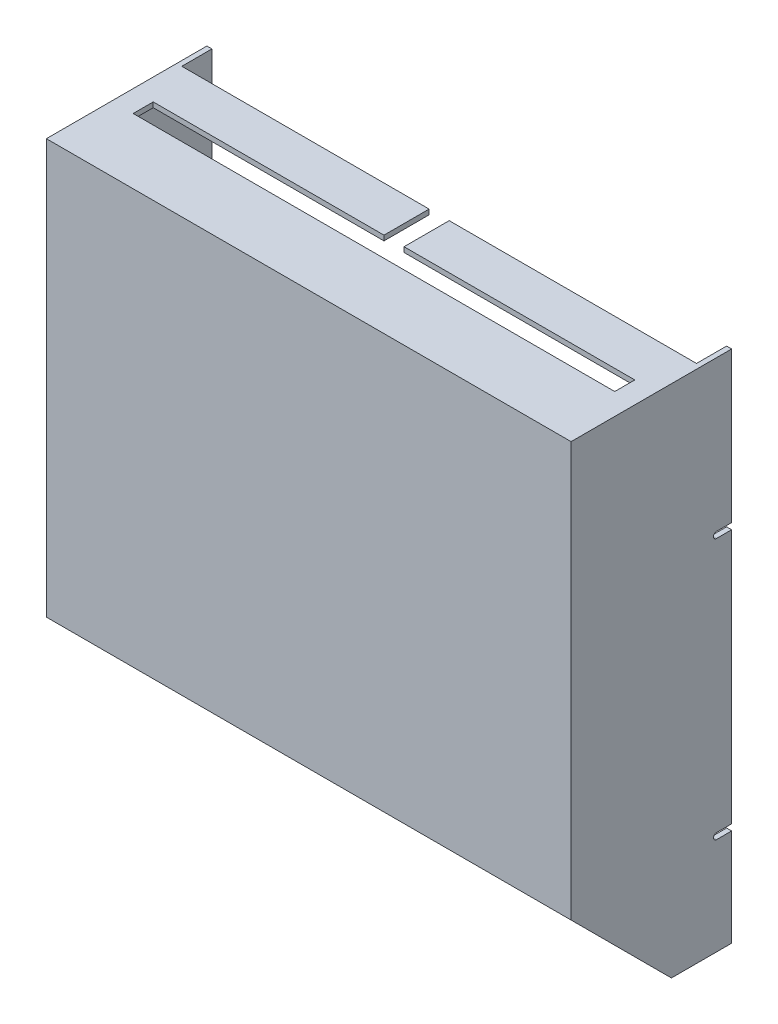
ISO-10303-21;
HEADER;
FILE_DESCRIPTION(('STEP AP214'),'2;1');
FILE_NAME('part.step','',(''),(''),'','','');
FILE_SCHEMA(('AUTOMOTIVE_DESIGN { 1 0 10303 214 1 1 1 1 }'));
ENDSEC;
DATA;
#1=APPLICATION_CONTEXT('core data for automotive mechanical design processes');
#2=APPLICATION_PROTOCOL_DEFINITION('international standard','automotive_design',2000,#1);
#3=PRODUCT_CONTEXT('',#1,'mechanical');
#4=PRODUCT('Part','Part','',(#3));
#5=PRODUCT_RELATED_PRODUCT_CATEGORY('part','',(#4));
#6=PRODUCT_DEFINITION_FORMATION('','',#4);
#7=PRODUCT_DEFINITION_CONTEXT('part definition',#1,'design');
#8=PRODUCT_DEFINITION('design','',#6,#7);
#9=PRODUCT_DEFINITION_SHAPE('','',#8);
#10=(LENGTH_UNIT() NAMED_UNIT(*) SI_UNIT(.MILLI.,.METRE.));
#11=(NAMED_UNIT(*) PLANE_ANGLE_UNIT() SI_UNIT($,.RADIAN.));
#12=(NAMED_UNIT(*) SI_UNIT($,.STERADIAN.) SOLID_ANGLE_UNIT());
#13=UNCERTAINTY_MEASURE_WITH_UNIT(LENGTH_MEASURE(1.E-05),#10,'distance_accuracy_value','');
#14=(GEOMETRIC_REPRESENTATION_CONTEXT(3) GLOBAL_UNCERTAINTY_ASSIGNED_CONTEXT((#13)) GLOBAL_UNIT_ASSIGNED_CONTEXT((#10,
#11,#12)) REPRESENTATION_CONTEXT('',''));
#15=CARTESIAN_POINT('',(0.,0.,0.));
#16=DIRECTION('',(0.,0.,1.));
#17=DIRECTION('',(1.,0.,0.));
#18=AXIS2_PLACEMENT_3D('',#15,#16,#17);
#19=CARTESIAN_POINT('',(0.,0.,-30.));
#20=DIRECTION('',(0.,0.,1.));
#21=DIRECTION('',(1.,0.,0.));
#22=AXIS2_PLACEMENT_3D('',#19,#20,#21);
#23=PLANE('',#22);
#24=DIRECTION('',(0.,-1.,0.));
#25=VECTOR('',#24,1.);
#26=CARTESIAN_POINT('',(283.,283.,-30.));
#27=LINE('',#26,#25);
#28=CARTESIAN_POINT('',(283.,-133.05,-30.));
#29=VERTEX_POINT('',#28);
#30=CARTESIAN_POINT('',(283.,-230.,-30.));
#31=VERTEX_POINT('',#30);
#32=EDGE_CURVE('E336',#29,#31,#27,.T.);
#33=ORIENTED_EDGE('',*,*,#32,.F.);
#34=DIRECTION('',(-1.,0.,0.));
#35=VECTOR('',#34,1.);
#36=CARTESIAN_POINT('',(307.052886920359,-133.05,-30.));
#37=LINE('',#36,#35);
#38=CARTESIAN_POINT('',(288.,-133.05,-30.));
#39=VERTEX_POINT('',#38);
#40=EDGE_CURVE('E535',#39,#29,#37,.T.);
#41=ORIENTED_EDGE('',*,*,#40,.F.);
#42=DIRECTION('',(0.,1.,0.));
#43=VECTOR('',#42,1.);
#44=CARTESIAN_POINT('',(288.,-230.,-30.));
#45=LINE('',#44,#43);
#46=CARTESIAN_POINT('',(288.,-230.,-30.));
#47=VERTEX_POINT('',#46);
#48=EDGE_CURVE('E340',#47,#39,#45,.T.);
#49=ORIENTED_EDGE('',*,*,#48,.F.);
#50=DIRECTION('',(1.,0.,0.));
#51=VECTOR('',#50,1.);
#52=CARTESIAN_POINT('',(283.,-230.,-30.));
#53=LINE('',#52,#51);
#54=EDGE_CURVE('E334',#31,#47,#53,.T.);
#55=ORIENTED_EDGE('',*,*,#54,.F.);
#56=EDGE_LOOP('',(#33,#41,#49,#55));
#57=FACE_BOUND('',#56,.T.);
#58=ADVANCED_FACE('F37',(#57),#23,.F.);
#59=CARTESIAN_POINT('',(0.,0.,-30.));
#60=DIRECTION('',(0.,0.,1.));
#61=DIRECTION('',(1.,0.,0.));
#62=AXIS2_PLACEMENT_3D('',#59,#60,#61);
#63=PLANE('',#62);
#64=DIRECTION('',(0.,-1.,0.));
#65=VECTOR('',#64,1.);
#66=CARTESIAN_POINT('',(-235.,283.,-30.));
#67=LINE('',#66,#65);
#68=CARTESIAN_POINT('',(-235.,-133.05,-30.));
#69=VERTEX_POINT('',#68);
#70=CARTESIAN_POINT('',(-235.,-230.,-30.));
#71=VERTEX_POINT('',#70);
#72=EDGE_CURVE('E306',#69,#71,#67,.T.);
#73=ORIENTED_EDGE('',*,*,#72,.F.);
#74=CARTESIAN_POINT('',(-230.,-133.05,-30.));
#75=VERTEX_POINT('',#74);
#76=EDGE_CURVE('E517',#75,#69,#37,.T.);
#77=ORIENTED_EDGE('',*,*,#76,.F.);
#78=DIRECTION('',(0.,1.,0.));
#79=VECTOR('',#78,1.);
#80=CARTESIAN_POINT('',(-230.,-230.,-30.));
#81=LINE('',#80,#79);
#82=CARTESIAN_POINT('',(-230.,-230.,-30.));
#83=VERTEX_POINT('',#82);
#84=EDGE_CURVE('E318',#83,#75,#81,.T.);
#85=ORIENTED_EDGE('',*,*,#84,.F.);
#86=DIRECTION('',(1.,0.,0.));
#87=VECTOR('',#86,1.);
#88=CARTESIAN_POINT('',(-235.,-230.,-30.));
#89=LINE('',#88,#87);
#90=EDGE_CURVE('E309',#71,#83,#89,.T.);
#91=ORIENTED_EDGE('',*,*,#90,.F.);
#92=EDGE_LOOP('',(#73,#77,#85,#91));
#93=FACE_BOUND('',#92,.T.);
#94=ADVANCED_FACE('F516',(#93),#63,.F.);
#95=CARTESIAN_POINT('',(288.,-126.95,-30.));
#96=VERTEX_POINT('',#95);
#97=CARTESIAN_POINT('',(288.,126.95,-30.));
#98=VERTEX_POINT('',#97);
#99=EDGE_CURVE('E344',#96,#98,#45,.T.);
#100=ORIENTED_EDGE('',*,*,#99,.F.);
#101=DIRECTION('',(-1.,0.,0.));
#102=VECTOR('',#101,1.);
#103=CARTESIAN_POINT('',(307.052886920359,-126.95,-30.));
#104=LINE('',#103,#102);
#105=CARTESIAN_POINT('',(283.,-126.95,-30.));
#106=VERTEX_POINT('',#105);
#107=EDGE_CURVE('E52',#96,#106,#104,.T.);
#108=ORIENTED_EDGE('',*,*,#107,.T.);
#109=CARTESIAN_POINT('',(283.,126.95,-30.));
#110=VERTEX_POINT('',#109);
#111=EDGE_CURVE('E335',#110,#106,#27,.T.);
#112=ORIENTED_EDGE('',*,*,#111,.F.);
#113=DIRECTION('',(-1.,0.,0.));
#114=VECTOR('',#113,1.);
#115=CARTESIAN_POINT('',(307.052886920359,126.95,-30.));
#116=LINE('',#115,#114);
#117=EDGE_CURVE('E569',#98,#110,#116,.T.);
#118=ORIENTED_EDGE('',*,*,#117,.F.);
#119=EDGE_LOOP('',(#100,#108,#112,#118));
#120=FACE_BOUND('',#119,.T.);
#121=ADVANCED_FACE('F689',(#120),#23,.F.);
#122=CARTESIAN_POINT('',(-230.,-126.95,-30.));
#123=VERTEX_POINT('',#122);
#124=CARTESIAN_POINT('',(-230.,126.95,-30.));
#125=VERTEX_POINT('',#124);
#126=EDGE_CURVE('E297',#123,#125,#81,.T.);
#127=ORIENTED_EDGE('',*,*,#126,.F.);
#128=CARTESIAN_POINT('',(-235.,-126.95,-30.));
#129=VERTEX_POINT('',#128);
#130=EDGE_CURVE('E285',#123,#129,#104,.T.);
#131=ORIENTED_EDGE('',*,*,#130,.T.);
#132=CARTESIAN_POINT('',(-235.,126.95,-30.));
#133=VERTEX_POINT('',#132);
#134=EDGE_CURVE('E296',#133,#129,#67,.T.);
#135=ORIENTED_EDGE('',*,*,#134,.F.);
#136=DIRECTION('',(1.,0.,0.));
#137=VECTOR('',#136,1.);
#138=CARTESIAN_POINT('',(0.,126.95,-30.));
#139=LINE('',#138,#137);
#140=EDGE_CURVE('E11',#133,#125,#139,.T.);
#141=ORIENTED_EDGE('',*,*,#140,.T.);
#142=EDGE_LOOP('',(#127,#131,#135,#141));
#143=FACE_BOUND('',#142,.T.);
#144=ADVANCED_FACE('F295',(#143),#63,.F.);
#145=CARTESIAN_POINT('',(0.,0.,0.));
#146=DIRECTION('',(0.,0.,-1.));
#147=DIRECTION('',(-1.,0.,0.));
#148=AXIS2_PLACEMENT_3D('',#145,#146,#147);
#149=PLANE('',#148);
#150=DIRECTION('',(0.,1.,0.));
#151=VECTOR('',#150,1.);
#152=CARTESIAN_POINT('',(-230.,-230.,0.));
#153=LINE('',#152,#151);
#154=CARTESIAN_POINT('',(-230.,278.,0.));
#155=VERTEX_POINT('',#154);
#156=CARTESIAN_POINT('',(-230.,283.,0.));
#157=VERTEX_POINT('',#156);
#158=EDGE_CURVE('E326',#155,#157,#153,.T.);
#159=ORIENTED_EDGE('',*,*,#158,.T.);
#160=DIRECTION('',(-1.,0.,0.));
#161=VECTOR('',#160,1.);
#162=CARTESIAN_POINT('',(288.,283.,0.));
#163=LINE('',#162,#161);
#164=CARTESIAN_POINT('',(16.4999999999999,283.,0.));
#165=VERTEX_POINT('',#164);
#166=EDGE_CURVE('E400',#165,#157,#163,.T.);
#167=ORIENTED_EDGE('',*,*,#166,.F.);
#168=DIRECTION('',(0.,1.,0.));
#169=VECTOR('',#168,1.);
#170=CARTESIAN_POINT('',(16.4999999999999,273.,0.));
#171=LINE('',#170,#169);
#172=CARTESIAN_POINT('',(16.4999999999999,278.,0.));
#173=VERTEX_POINT('',#172);
#174=EDGE_CURVE('E452',#173,#165,#171,.T.);
#175=ORIENTED_EDGE('',*,*,#174,.F.);
#176=DIRECTION('',(-1.,0.,0.));
#177=VECTOR('',#176,1.);
#178=CARTESIAN_POINT('',(0.,278.,0.));
#179=LINE('',#178,#177);
#180=EDGE_CURVE('E376',#173,#155,#179,.T.);
#181=ORIENTED_EDGE('',*,*,#180,.T.);
#182=EDGE_LOOP('',(#159,#167,#175,#181));
#183=FACE_BOUND('',#182,.T.);
#184=ADVANCED_FACE('F461',(#183),#149,.T.);
#185=CARTESIAN_POINT('',(283.,283.,0.));
#186=VERTEX_POINT('',#185);
#187=CARTESIAN_POINT('',(36.4999999999999,283.,-5.05238212378245E-13));
#188=VERTEX_POINT('',#187);
#189=EDGE_CURVE('E358',#186,#188,#163,.T.);
#190=ORIENTED_EDGE('',*,*,#189,.F.);
#191=DIRECTION('',(0.,-1.,0.));
#192=VECTOR('',#191,1.);
#193=CARTESIAN_POINT('',(283.,283.,0.));
#194=LINE('',#193,#192);
#195=CARTESIAN_POINT('',(283.,278.,0.));
#196=VERTEX_POINT('',#195);
#197=EDGE_CURVE('E329',#186,#196,#194,.T.);
#198=ORIENTED_EDGE('',*,*,#197,.T.);
#199=CARTESIAN_POINT('',(36.4999999999999,278.,-5.05238212378245E-13));
#200=VERTEX_POINT('',#199);
#201=EDGE_CURVE('E380',#196,#200,#179,.T.);
#202=ORIENTED_EDGE('',*,*,#201,.T.);
#203=DIRECTION('',(0.,1.,0.));
#204=VECTOR('',#203,1.);
#205=CARTESIAN_POINT('',(36.4999999999999,273.,-5.05238212378245E-13));
#206=LINE('',#205,#204);
#207=EDGE_CURVE('E464',#200,#188,#206,.T.);
#208=ORIENTED_EDGE('',*,*,#207,.T.);
#209=EDGE_LOOP('',(#190,#198,#202,#208));
#210=FACE_BOUND('',#209,.T.);
#211=ADVANCED_FACE('F611',(#210),#149,.T.);
#212=CARTESIAN_POINT('',(-230.,-230.,0.));
#213=VERTEX_POINT('',#212);
#214=CARTESIAN_POINT('',(-230.,-225.,0.));
#215=VERTEX_POINT('',#214);
#216=EDGE_CURVE('E310',#213,#215,#153,.T.);
#217=ORIENTED_EDGE('',*,*,#216,.T.);
#218=DIRECTION('',(1.,0.,0.));
#219=VECTOR('',#218,1.);
#220=CARTESIAN_POINT('',(0.,-225.,0.));
#221=LINE('',#220,#219);
#222=CARTESIAN_POINT('',(283.,-225.,0.));
#223=VERTEX_POINT('',#222);
#224=EDGE_CURVE('E373',#215,#223,#221,.T.);
#225=ORIENTED_EDGE('',*,*,#224,.T.);
#226=CARTESIAN_POINT('',(283.,-230.,0.));
#227=VERTEX_POINT('',#226);
#228=EDGE_CURVE('E353',#223,#227,#194,.T.);
#229=ORIENTED_EDGE('',*,*,#228,.T.);
#230=DIRECTION('',(1.,0.,0.));
#231=VECTOR('',#230,1.);
#232=CARTESIAN_POINT('',(288.,-230.,0.));
#233=LINE('',#232,#231);
#234=EDGE_CURVE('E369',#213,#227,#233,.T.);
#235=ORIENTED_EDGE('',*,*,#234,.F.);
#236=EDGE_LOOP('',(#217,#225,#229,#235));
#237=FACE_BOUND('',#236,.T.);
#238=ADVANCED_FACE('F508',(#237),#149,.T.);
#239=CARTESIAN_POINT('',(288.,-225.,130.));
#240=DIRECTION('',(0.,1.,0.));
#241=DIRECTION('',(-1.,0.,0.));
#242=AXIS2_PLACEMENT_3D('',#239,#240,#241);
#243=PLANE('',#242);
#244=DIRECTION('',(0.,0.,-1.));
#245=VECTOR('',#244,1.);
#246=CARTESIAN_POINT('',(-230.,-225.,130.));
#247=LINE('',#246,#245);
#248=CARTESIAN_POINT('',(-230.,-225.,27.9289321881345));
#249=VERTEX_POINT('',#248);
#250=EDGE_CURVE('E475',#249,#215,#247,.T.);
#251=ORIENTED_EDGE('',*,*,#250,.F.);
#252=DIRECTION('',(1.,0.,0.));
#253=VECTOR('',#252,1.);
#254=CARTESIAN_POINT('',(288.,-225.,27.9289321881346));
#255=LINE('',#254,#253);
#256=CARTESIAN_POINT('',(283.,-225.,27.9289321881346));
#257=VERTEX_POINT('',#256);
#258=EDGE_CURVE('E506',#249,#257,#255,.T.);
#259=ORIENTED_EDGE('',*,*,#258,.T.);
#260=DIRECTION('',(0.,0.,-1.));
#261=VECTOR('',#260,1.);
#262=CARTESIAN_POINT('',(283.,-225.,130.));
#263=LINE('',#262,#261);
#264=EDGE_CURVE('E366',#257,#223,#263,.T.);
#265=ORIENTED_EDGE('',*,*,#264,.T.);
#266=ORIENTED_EDGE('',*,*,#224,.F.);
#267=EDGE_LOOP('',(#251,#259,#265,#266));
#268=FACE_BOUND('',#267,.T.);
#269=ADVANCED_FACE('F505',(#268),#243,.T.);
#270=CARTESIAN_POINT('',(283.,-230.,130.));
#271=DIRECTION('',(-1.,0.,0.));
#272=DIRECTION('',(0.,0.,1.));
#273=AXIS2_PLACEMENT_3D('',#270,#271,#272);
#274=PLANE('',#273);
#275=DIRECTION('',(0.,0.,1.));
#276=VECTOR('',#275,1.);
#277=CARTESIAN_POINT('',(283.,-133.05,130.));
#278=LINE('',#277,#276);
#279=CARTESIAN_POINT('',(283.,-133.05,-15.));
#280=VERTEX_POINT('',#279);
#281=EDGE_CURVE('E547',#29,#280,#278,.T.);
#282=ORIENTED_EDGE('',*,*,#281,.F.);
#283=ORIENTED_EDGE('',*,*,#32,.T.);
#284=DIRECTION('',(0.,0.,1.));
#285=VECTOR('',#284,1.);
#286=CARTESIAN_POINT('',(283.,-230.,-30.));
#287=LINE('',#286,#285);
#288=EDGE_CURVE('E347',#31,#227,#287,.T.);
#289=ORIENTED_EDGE('',*,*,#288,.T.);
#290=ORIENTED_EDGE('',*,*,#228,.F.);
#291=ORIENTED_EDGE('',*,*,#264,.F.);
#292=DIRECTION('',(0.,0.707106781186548,0.707106781186548));
#293=VECTOR('',#292,1.);
#294=CARTESIAN_POINT('',(283.,-176.464466094067,76.4644660940673));
#295=LINE('',#294,#293);
#296=CARTESIAN_POINT('',(283.,-127.928932188135,125.));
#297=VERTEX_POINT('',#296);
#298=EDGE_CURVE('E488',#257,#297,#295,.T.);
#299=ORIENTED_EDGE('',*,*,#298,.T.);
#300=DIRECTION('',(0.,1.,0.));
#301=VECTOR('',#300,1.);
#302=CARTESIAN_POINT('',(283.,0.,125.));
#303=LINE('',#302,#301);
#304=CARTESIAN_POINT('',(283.,278.,125.));
#305=VERTEX_POINT('',#304);
#306=EDGE_CURVE('E384',#297,#305,#303,.T.);
#307=ORIENTED_EDGE('',*,*,#306,.T.);
#308=DIRECTION('',(0.,0.,-1.));
#309=VECTOR('',#308,1.);
#310=CARTESIAN_POINT('',(283.,278.,130.));
#311=LINE('',#310,#309);
#312=EDGE_CURVE('E370',#305,#196,#311,.T.);
#313=ORIENTED_EDGE('',*,*,#312,.T.);
#314=ORIENTED_EDGE('',*,*,#197,.F.);
#315=DIRECTION('',(0.,0.,1.));
#316=VECTOR('',#315,1.);
#317=CARTESIAN_POINT('',(283.,283.,-30.));
#318=LINE('',#317,#316);
#319=CARTESIAN_POINT('',(283.,283.,-30.));
#320=VERTEX_POINT('',#319);
#321=EDGE_CURVE('E363',#320,#186,#318,.T.);
#322=ORIENTED_EDGE('',*,*,#321,.F.);
#323=CARTESIAN_POINT('',(283.,133.05,-30.));
#324=VERTEX_POINT('',#323);
#325=EDGE_CURVE('E331',#320,#324,#27,.T.);
#326=ORIENTED_EDGE('',*,*,#325,.T.);
#327=DIRECTION('',(0.,0.,-1.));
#328=VECTOR('',#327,1.);
#329=CARTESIAN_POINT('',(283.,133.05,130.));
#330=LINE('',#329,#328);
#331=CARTESIAN_POINT('',(283.,133.05,-15.));
#332=VERTEX_POINT('',#331);
#333=EDGE_CURVE('E580',#332,#324,#330,.T.);
#334=ORIENTED_EDGE('',*,*,#333,.F.);
#335=CARTESIAN_POINT('',(283.,130.,-15.));
#336=DIRECTION('',(-1.,0.,0.));
#337=DIRECTION('',(0.,0.,1.));
#338=AXIS2_PLACEMENT_3D('',#335,#336,#337);
#339=CIRCLE('',#338,3.05);
#340=CARTESIAN_POINT('',(283.,126.95,-15.));
#341=VERTEX_POINT('',#340);
#342=EDGE_CURVE('E313',#341,#332,#339,.T.);
#343=ORIENTED_EDGE('',*,*,#342,.F.);
#344=DIRECTION('',(0.,0.,1.));
#345=VECTOR('',#344,1.);
#346=CARTESIAN_POINT('',(283.,126.95,130.));
#347=LINE('',#346,#345);
#348=EDGE_CURVE('E585',#110,#341,#347,.T.);
#349=ORIENTED_EDGE('',*,*,#348,.F.);
#350=ORIENTED_EDGE('',*,*,#111,.T.);
#351=DIRECTION('',(0.,0.,-1.));
#352=VECTOR('',#351,1.);
#353=CARTESIAN_POINT('',(283.,-126.95,130.));
#354=LINE('',#353,#352);
#355=CARTESIAN_POINT('',(283.,-126.95,-15.));
#356=VERTEX_POINT('',#355);
#357=EDGE_CURVE('E543',#356,#106,#354,.T.);
#358=ORIENTED_EDGE('',*,*,#357,.F.);
#359=CARTESIAN_POINT('',(283.,-130.,-15.));
#360=DIRECTION('',(-1.,0.,0.));
#361=DIRECTION('',(0.,0.,1.));
#362=AXIS2_PLACEMENT_3D('',#359,#360,#361);
#363=CIRCLE('',#362,3.05);
#364=EDGE_CURVE('E551',#280,#356,#363,.T.);
#365=ORIENTED_EDGE('',*,*,#364,.F.);
#366=EDGE_LOOP('',(#282,#283,#289,#290,#291,#299,#307,#313,#314,#322,#326,#334,#343,#349,#350,
#358,#365));
#367=FACE_BOUND('',#366,.T.);
#368=ADVANCED_FACE('F485',(#367),#274,.T.);
#369=CARTESIAN_POINT('',(-230.,-230.,130.));
#370=DIRECTION('',(1.,0.,0.));
#371=DIRECTION('',(0.,0.,-1.));
#372=AXIS2_PLACEMENT_3D('',#369,#370,#371);
#373=PLANE('',#372);
#374=DIRECTION('',(0.,0.,-1.));
#375=VECTOR('',#374,1.);
#376=CARTESIAN_POINT('',(-230.,-133.05,130.));
#377=LINE('',#376,#375);
#378=CARTESIAN_POINT('',(-230.,-133.05,-15.));
#379=VERTEX_POINT('',#378);
#380=EDGE_CURVE('E545',#379,#75,#377,.T.);
#381=ORIENTED_EDGE('',*,*,#380,.F.);
#382=CARTESIAN_POINT('',(-230.,-130.,-15.));
#383=DIRECTION('',(1.,0.,0.));
#384=DIRECTION('',(0.,0.,-1.));
#385=AXIS2_PLACEMENT_3D('',#382,#383,#384);
#386=CIRCLE('',#385,3.05);
#387=CARTESIAN_POINT('',(-230.,-126.95,-15.));
#388=VERTEX_POINT('',#387);
#389=EDGE_CURVE('E549',#388,#379,#386,.T.);
#390=ORIENTED_EDGE('',*,*,#389,.F.);
#391=DIRECTION('',(0.,0.,1.));
#392=VECTOR('',#391,1.);
#393=CARTESIAN_POINT('',(-230.,-126.95,130.));
#394=LINE('',#393,#392);
#395=EDGE_CURVE('E540',#123,#388,#394,.T.);
#396=ORIENTED_EDGE('',*,*,#395,.F.);
#397=ORIENTED_EDGE('',*,*,#126,.T.);
#398=DIRECTION('',(0.,0.,-1.));
#399=VECTOR('',#398,1.);
#400=CARTESIAN_POINT('',(-230.,126.95,130.));
#401=LINE('',#400,#399);
#402=CARTESIAN_POINT('',(-230.,126.95,-15.));
#403=VERTEX_POINT('',#402);
#404=EDGE_CURVE('E582',#403,#125,#401,.T.);
#405=ORIENTED_EDGE('',*,*,#404,.F.);
#406=CARTESIAN_POINT('',(-230.,130.,-15.));
#407=DIRECTION('',(1.,0.,0.));
#408=DIRECTION('',(0.,0.,-1.));
#409=AXIS2_PLACEMENT_3D('',#406,#407,#408);
#410=CIRCLE('',#409,3.05);
#411=CARTESIAN_POINT('',(-230.,133.05,-15.));
#412=VERTEX_POINT('',#411);
#413=EDGE_CURVE('E586',#412,#403,#410,.T.);
#414=ORIENTED_EDGE('',*,*,#413,.F.);
#415=DIRECTION('',(0.,0.,1.));
#416=VECTOR('',#415,1.);
#417=CARTESIAN_POINT('',(-230.,133.05,130.));
#418=LINE('',#417,#416);
#419=CARTESIAN_POINT('',(-230.,133.05,-30.));
#420=VERTEX_POINT('',#419);
#421=EDGE_CURVE('E578',#420,#412,#418,.T.);
#422=ORIENTED_EDGE('',*,*,#421,.F.);
#423=CARTESIAN_POINT('',(-230.,283.,-30.));
#424=VERTEX_POINT('',#423);
#425=EDGE_CURVE('E317',#420,#424,#81,.T.);
#426=ORIENTED_EDGE('',*,*,#425,.T.);
#427=DIRECTION('',(0.,0.,1.));
#428=VECTOR('',#427,1.);
#429=CARTESIAN_POINT('',(-230.,283.,-30.));
#430=LINE('',#429,#428);
#431=EDGE_CURVE('E327',#424,#157,#430,.T.);
#432=ORIENTED_EDGE('',*,*,#431,.T.);
#433=ORIENTED_EDGE('',*,*,#158,.F.);
#434=DIRECTION('',(0.,0.,-1.));
#435=VECTOR('',#434,1.);
#436=CARTESIAN_POINT('',(-230.,278.,130.));
#437=LINE('',#436,#435);
#438=CARTESIAN_POINT('',(-230.,278.,125.));
#439=VERTEX_POINT('',#438);
#440=EDGE_CURVE('E468',#439,#155,#437,.T.);
#441=ORIENTED_EDGE('',*,*,#440,.F.);
#442=DIRECTION('',(0.,-1.,0.));
#443=VECTOR('',#442,1.);
#444=CARTESIAN_POINT('',(-230.,0.,125.));
#445=LINE('',#444,#443);
#446=CARTESIAN_POINT('',(-230.,-127.928932188135,125.));
#447=VERTEX_POINT('',#446);
#448=EDGE_CURVE('E390',#439,#447,#445,.T.);
#449=ORIENTED_EDGE('',*,*,#448,.T.);
#450=DIRECTION('',(0.,-0.707106781186548,-0.707106781186548));
#451=VECTOR('',#450,1.);
#452=CARTESIAN_POINT('',(-230.,-176.464466094067,76.4644660940672));
#453=LINE('',#452,#451);
#454=EDGE_CURVE('E496',#447,#249,#453,.T.);
#455=ORIENTED_EDGE('',*,*,#454,.T.);
#456=ORIENTED_EDGE('',*,*,#250,.T.);
#457=ORIENTED_EDGE('',*,*,#216,.F.);
#458=DIRECTION('',(0.,0.,1.));
#459=VECTOR('',#458,1.);
#460=CARTESIAN_POINT('',(-230.,-230.,-30.));
#461=LINE('',#460,#459);
#462=EDGE_CURVE('E324',#83,#213,#461,.T.);
#463=ORIENTED_EDGE('',*,*,#462,.F.);
#464=ORIENTED_EDGE('',*,*,#84,.T.);
#465=EDGE_LOOP('',(#381,#390,#396,#397,#405,#414,#422,#426,#432,#433,#441,#449,#455,#456,#457,
#463,#464));
#466=FACE_BOUND('',#465,.T.);
#467=ADVANCED_FACE('F495',(#466),#373,.T.);
#468=CARTESIAN_POINT('',(0.,0.,125.));
#469=DIRECTION('',(0.,0.,-1.));
#470=DIRECTION('',(-1.,0.,0.));
#471=AXIS2_PLACEMENT_3D('',#468,#469,#470);
#472=PLANE('',#471);
#473=ORIENTED_EDGE('',*,*,#306,.F.);
#474=DIRECTION('',(-1.,0.,0.));
#475=VECTOR('',#474,1.);
#476=CARTESIAN_POINT('',(0.,-127.928932188135,125.));
#477=LINE('',#476,#475);
#478=EDGE_CURVE('E431',#297,#447,#477,.T.);
#479=ORIENTED_EDGE('',*,*,#478,.T.);
#480=ORIENTED_EDGE('',*,*,#448,.F.);
#481=DIRECTION('',(-1.,0.,0.));
#482=VECTOR('',#481,1.);
#483=CARTESIAN_POINT('',(0.,278.,125.));
#484=LINE('',#483,#482);
#485=EDGE_CURVE('E471',#305,#439,#484,.T.);
#486=ORIENTED_EDGE('',*,*,#485,.F.);
#487=EDGE_LOOP('',(#473,#479,#480,#486));
#488=FACE_BOUND('',#487,.T.);
#489=ADVANCED_FACE('F492',(#488),#472,.T.);
#490=CARTESIAN_POINT('',(288.,-230.,130.));
#491=DIRECTION('',(0.,1.,0.));
#492=DIRECTION('',(-1.,0.,0.));
#493=AXIS2_PLACEMENT_3D('',#490,#491,#492);
#494=PLANE('',#493);
#495=DIRECTION('',(0.,0.,-1.));
#496=VECTOR('',#495,1.);
#497=CARTESIAN_POINT('',(-235.,-230.,130.));
#498=LINE('',#497,#496);
#499=CARTESIAN_POINT('',(-235.,-230.,30.));
#500=VERTEX_POINT('',#499);
#501=EDGE_CURVE('E398',#500,#71,#498,.T.);
#502=ORIENTED_EDGE('',*,*,#501,.T.);
#503=ORIENTED_EDGE('',*,*,#90,.T.);
#504=ORIENTED_EDGE('',*,*,#462,.T.);
#505=ORIENTED_EDGE('',*,*,#234,.T.);
#506=ORIENTED_EDGE('',*,*,#288,.F.);
#507=ORIENTED_EDGE('',*,*,#54,.T.);
#508=DIRECTION('',(0.,0.,-1.));
#509=VECTOR('',#508,1.);
#510=CARTESIAN_POINT('',(288.,-230.,130.));
#511=LINE('',#510,#509);
#512=CARTESIAN_POINT('',(288.,-230.,30.));
#513=VERTEX_POINT('',#512);
#514=EDGE_CURVE('E426',#513,#47,#511,.T.);
#515=ORIENTED_EDGE('',*,*,#514,.F.);
#516=DIRECTION('',(1.,0.,0.));
#517=VECTOR('',#516,1.);
#518=CARTESIAN_POINT('',(-376.42135623731,-230.,30.));
#519=LINE('',#518,#517);
#520=EDGE_CURVE('E521',#500,#513,#519,.T.);
#521=ORIENTED_EDGE('',*,*,#520,.F.);
#522=EDGE_LOOP('',(#502,#503,#504,#505,#506,#507,#515,#521));
#523=FACE_BOUND('',#522,.T.);
#524=ADVANCED_FACE('F39',(#523),#494,.F.);
#525=CARTESIAN_POINT('',(288.,-230.,130.));
#526=DIRECTION('',(-1.,0.,0.));
#527=DIRECTION('',(0.,0.,1.));
#528=AXIS2_PLACEMENT_3D('',#525,#526,#527);
#529=PLANE('',#528);
#530=ORIENTED_EDGE('',*,*,#48,.T.);
#531=DIRECTION('',(0.,0.,-1.));
#532=VECTOR('',#531,1.);
#533=CARTESIAN_POINT('',(288.,-133.05,-15.));
#534=LINE('',#533,#532);
#535=CARTESIAN_POINT('',(288.,-133.05,-15.));
#536=VERTEX_POINT('',#535);
#537=EDGE_CURVE('E533',#536,#39,#534,.T.);
#538=ORIENTED_EDGE('',*,*,#537,.F.);
#539=CARTESIAN_POINT('',(288.,-130.,-15.));
#540=DIRECTION('',(-1.,0.,0.));
#541=DIRECTION('',(0.,0.,1.));
#542=AXIS2_PLACEMENT_3D('',#539,#540,#541);
#543=CIRCLE('',#542,3.05);
#544=CARTESIAN_POINT('',(288.,-126.95,-15.));
#545=VERTEX_POINT('',#544);
#546=EDGE_CURVE('E541',#545,#536,#543,.F.);
#547=ORIENTED_EDGE('',*,*,#546,.F.);
#548=DIRECTION('',(0.,0.,1.));
#549=VECTOR('',#548,1.);
#550=CARTESIAN_POINT('',(288.,-126.95,-15.));
#551=LINE('',#550,#549);
#552=EDGE_CURVE('E538',#96,#545,#551,.T.);
#553=ORIENTED_EDGE('',*,*,#552,.F.);
#554=ORIENTED_EDGE('',*,*,#99,.T.);
#555=DIRECTION('',(0.,0.,-1.));
#556=VECTOR('',#555,1.);
#557=CARTESIAN_POINT('',(288.,126.95,-15.));
#558=LINE('',#557,#556);
#559=CARTESIAN_POINT('',(288.,126.95,-15.));
#560=VERTEX_POINT('',#559);
#561=EDGE_CURVE('E554',#560,#98,#558,.T.);
#562=ORIENTED_EDGE('',*,*,#561,.F.);
#563=CARTESIAN_POINT('',(288.,130.,-15.));
#564=DIRECTION('',(-1.,0.,0.));
#565=DIRECTION('',(0.,0.,1.));
#566=AXIS2_PLACEMENT_3D('',#563,#564,#565);
#567=CIRCLE('',#566,3.05);
#568=CARTESIAN_POINT('',(288.,133.05,-15.));
#569=VERTEX_POINT('',#568);
#570=EDGE_CURVE('E557',#569,#560,#567,.F.);
#571=ORIENTED_EDGE('',*,*,#570,.F.);
#572=DIRECTION('',(0.,0.,1.));
#573=VECTOR('',#572,1.);
#574=CARTESIAN_POINT('',(288.,133.05,-15.));
#575=LINE('',#574,#573);
#576=CARTESIAN_POINT('',(288.,133.05,-30.));
#577=VERTEX_POINT('',#576);
#578=EDGE_CURVE('E560',#577,#569,#575,.T.);
#579=ORIENTED_EDGE('',*,*,#578,.F.);
#580=CARTESIAN_POINT('',(288.,283.,-30.));
#581=VERTEX_POINT('',#580);
#582=EDGE_CURVE('E339',#577,#581,#45,.T.);
#583=ORIENTED_EDGE('',*,*,#582,.T.);
#584=DIRECTION('',(0.,0.,-1.));
#585=VECTOR('',#584,1.);
#586=CARTESIAN_POINT('',(288.,283.,130.));
#587=LINE('',#586,#585);
#588=CARTESIAN_POINT('',(288.,283.,130.));
#589=VERTEX_POINT('',#588);
#590=EDGE_CURVE('E423',#589,#581,#587,.T.);
#591=ORIENTED_EDGE('',*,*,#590,.F.);
#592=DIRECTION('',(0.,1.,0.));
#593=VECTOR('',#592,1.);
#594=CARTESIAN_POINT('',(288.,-230.,130.));
#595=LINE('',#594,#593);
#596=CARTESIAN_POINT('',(288.,-130.,130.));
#597=VERTEX_POINT('',#596);
#598=EDGE_CURVE('E392',#597,#589,#595,.T.);
#599=ORIENTED_EDGE('',*,*,#598,.F.);
#600=DIRECTION('',(0.,-0.707106781186548,-0.707106781186548));
#601=VECTOR('',#600,1.);
#602=CARTESIAN_POINT('',(288.,-130.,130.));
#603=LINE('',#602,#601);
#604=EDGE_CURVE('E621',#597,#513,#603,.T.);
#605=ORIENTED_EDGE('',*,*,#604,.T.);
#606=ORIENTED_EDGE('',*,*,#514,.T.);
#607=EDGE_LOOP('',(#530,#538,#547,#553,#554,#562,#571,#579,#583,#591,#599,#605,#606));
#608=FACE_BOUND('',#607,.T.);
#609=ADVANCED_FACE('F635',(#608),#529,.F.);
#610=CARTESIAN_POINT('',(-235.,-230.,130.));
#611=DIRECTION('',(1.,0.,0.));
#612=DIRECTION('',(0.,0.,-1.));
#613=AXIS2_PLACEMENT_3D('',#610,#611,#612);
#614=PLANE('',#613);
#615=CARTESIAN_POINT('',(-235.,-130.,-15.));
#616=DIRECTION('',(-1.,0.,0.));
#617=DIRECTION('',(0.,0.,-1.));
#618=AXIS2_PLACEMENT_3D('',#615,#616,#617);
#619=CIRCLE('',#618,3.05);
#620=CARTESIAN_POINT('',(-235.,-133.05,-15.));
#621=VERTEX_POINT('',#620);
#622=CARTESIAN_POINT('',(-235.,-126.95,-15.));
#623=VERTEX_POINT('',#622);
#624=EDGE_CURVE('E60',#621,#623,#619,.T.);
#625=ORIENTED_EDGE('',*,*,#624,.F.);
#626=DIRECTION('',(0.,0.,1.));
#627=VECTOR('',#626,1.);
#628=CARTESIAN_POINT('',(-235.,-133.05,-15.));
#629=LINE('',#628,#627);
#630=EDGE_CURVE('E290',#69,#621,#629,.T.);
#631=ORIENTED_EDGE('',*,*,#630,.F.);
#632=ORIENTED_EDGE('',*,*,#72,.T.);
#633=ORIENTED_EDGE('',*,*,#501,.F.);
#634=DIRECTION('',(0.,0.707106781186548,0.707106781186548));
#635=VECTOR('',#634,1.);
#636=CARTESIAN_POINT('',(-235.,-130.,130.));
#637=LINE('',#636,#635);
#638=CARTESIAN_POINT('',(-235.,-130.,130.));
#639=VERTEX_POINT('',#638);
#640=EDGE_CURVE('E377',#500,#639,#637,.T.);
#641=ORIENTED_EDGE('',*,*,#640,.T.);
#642=DIRECTION('',(0.,-1.,0.));
#643=VECTOR('',#642,1.);
#644=CARTESIAN_POINT('',(-235.,-230.,130.));
#645=LINE('',#644,#643);
#646=CARTESIAN_POINT('',(-235.,283.,130.));
#647=VERTEX_POINT('',#646);
#648=EDGE_CURVE('E396',#647,#639,#645,.T.);
#649=ORIENTED_EDGE('',*,*,#648,.F.);
#650=DIRECTION('',(0.,0.,-1.));
#651=VECTOR('',#650,1.);
#652=CARTESIAN_POINT('',(-235.,283.,130.));
#653=LINE('',#652,#651);
#654=CARTESIAN_POINT('',(-235.,283.,-30.));
#655=VERTEX_POINT('',#654);
#656=EDGE_CURVE('E419',#647,#655,#653,.T.);
#657=ORIENTED_EDGE('',*,*,#656,.T.);
#658=CARTESIAN_POINT('',(-235.,133.05,-30.));
#659=VERTEX_POINT('',#658);
#660=EDGE_CURVE('E305',#655,#659,#67,.T.);
#661=ORIENTED_EDGE('',*,*,#660,.T.);
#662=DIRECTION('',(0.,0.,-1.));
#663=VECTOR('',#662,1.);
#664=CARTESIAN_POINT('',(-235.,133.05,-15.));
#665=LINE('',#664,#663);
#666=CARTESIAN_POINT('',(-235.,133.05,-15.));
#667=VERTEX_POINT('',#666);
#668=EDGE_CURVE('E416',#667,#659,#665,.T.);
#669=ORIENTED_EDGE('',*,*,#668,.F.);
#670=CARTESIAN_POINT('',(-235.,130.,-15.));
#671=DIRECTION('',(-1.,0.,0.));
#672=DIRECTION('',(0.,0.,1.));
#673=AXIS2_PLACEMENT_3D('',#670,#671,#672);
#674=CIRCLE('',#673,3.05);
#675=CARTESIAN_POINT('',(-235.,126.95,-15.));
#676=VERTEX_POINT('',#675);
#677=EDGE_CURVE('E553',#676,#667,#674,.T.);
#678=ORIENTED_EDGE('',*,*,#677,.F.);
#679=DIRECTION('',(0.,0.,1.));
#680=VECTOR('',#679,1.);
#681=CARTESIAN_POINT('',(-235.,126.95,-15.));
#682=LINE('',#681,#680);
#683=EDGE_CURVE('E304',#133,#676,#682,.T.);
#684=ORIENTED_EDGE('',*,*,#683,.F.);
#685=ORIENTED_EDGE('',*,*,#134,.T.);
#686=DIRECTION('',(0.,0.,-1.));
#687=VECTOR('',#686,1.);
#688=CARTESIAN_POINT('',(-235.,-126.95,-15.));
#689=LINE('',#688,#687);
#690=EDGE_CURVE('E282',#623,#129,#689,.T.);
#691=ORIENTED_EDGE('',*,*,#690,.F.);
#692=EDGE_LOOP('',(#625,#631,#632,#633,#641,#649,#657,#661,#669,#678,#684,#685,#691));
#693=FACE_BOUND('',#692,.T.);
#694=ADVANCED_FACE('F301',(#693),#614,.F.);
#695=CARTESIAN_POINT('',(0.,0.,130.));
#696=DIRECTION('',(0.,0.,-1.));
#697=DIRECTION('',(-1.,0.,0.));
#698=AXIS2_PLACEMENT_3D('',#695,#696,#697);
#699=PLANE('',#698);
#700=ORIENTED_EDGE('',*,*,#598,.T.);
#701=DIRECTION('',(-1.,0.,0.));
#702=VECTOR('',#701,1.);
#703=CARTESIAN_POINT('',(288.,283.,130.));
#704=LINE('',#703,#702);
#705=EDGE_CURVE('E394',#589,#647,#704,.T.);
#706=ORIENTED_EDGE('',*,*,#705,.T.);
#707=ORIENTED_EDGE('',*,*,#648,.T.);
#708=DIRECTION('',(1.,0.,0.));
#709=VECTOR('',#708,1.);
#710=CARTESIAN_POINT('',(-376.42135623731,-130.,130.));
#711=LINE('',#710,#709);
#712=EDGE_CURVE('E625',#639,#597,#711,.T.);
#713=ORIENTED_EDGE('',*,*,#712,.T.);
#714=EDGE_LOOP('',(#700,#706,#707,#713));
#715=FACE_BOUND('',#714,.T.);
#716=ADVANCED_FACE('F631',(#715),#699,.F.);
#717=CARTESIAN_POINT('',(288.,283.,130.));
#718=DIRECTION('',(0.,-1.,0.));
#719=DIRECTION('',(1.,0.,0.));
#720=AXIS2_PLACEMENT_3D('',#717,#718,#719);
#721=PLANE('',#720);
#722=DIRECTION('',(-1.,0.,0.));
#723=VECTOR('',#722,1.);
#724=CARTESIAN_POINT('',(-213.5,283.,45.));
#725=LINE('',#724,#723);
#726=CARTESIAN_POINT('',(16.4999999999999,283.,45.));
#727=VERTEX_POINT('',#726);
#728=CARTESIAN_POINT('',(-213.5,283.,45.));
#729=VERTEX_POINT('',#728);
#730=EDGE_CURVE('E652',#727,#729,#725,.T.);
#731=ORIENTED_EDGE('',*,*,#730,.F.);
#732=DIRECTION('',(0.,0.,1.));
#733=VECTOR('',#732,1.);
#734=CARTESIAN_POINT('',(16.4999999999999,283.,0.));
#735=LINE('',#734,#733);
#736=EDGE_CURVE('E597',#165,#727,#735,.T.);
#737=ORIENTED_EDGE('',*,*,#736,.F.);
#738=ORIENTED_EDGE('',*,*,#166,.T.);
#739=ORIENTED_EDGE('',*,*,#431,.F.);
#740=DIRECTION('',(-1.,0.,0.));
#741=VECTOR('',#740,1.);
#742=CARTESIAN_POINT('',(-230.,283.,-30.));
#743=LINE('',#742,#741);
#744=EDGE_CURVE('E321',#424,#655,#743,.T.);
#745=ORIENTED_EDGE('',*,*,#744,.T.);
#746=ORIENTED_EDGE('',*,*,#656,.F.);
#747=ORIENTED_EDGE('',*,*,#705,.F.);
#748=ORIENTED_EDGE('',*,*,#590,.T.);
#749=DIRECTION('',(-1.,0.,0.));
#750=VECTOR('',#749,1.);
#751=CARTESIAN_POINT('',(288.,283.,-30.));
#752=LINE('',#751,#750);
#753=EDGE_CURVE('E343',#581,#320,#752,.T.);
#754=ORIENTED_EDGE('',*,*,#753,.T.);
#755=ORIENTED_EDGE('',*,*,#321,.T.);
#756=ORIENTED_EDGE('',*,*,#189,.T.);
#757=DIRECTION('',(0.,0.,-1.));
#758=VECTOR('',#757,1.);
#759=CARTESIAN_POINT('',(36.4999999999999,283.,-5.05238212378245E-13));
#760=LINE('',#759,#758);
#761=CARTESIAN_POINT('',(36.5,283.,45.));
#762=VERTEX_POINT('',#761);
#763=EDGE_CURVE('E602',#762,#188,#760,.T.);
#764=ORIENTED_EDGE('',*,*,#763,.F.);
#765=DIRECTION('',(-1.,0.,0.));
#766=VECTOR('',#765,1.);
#767=CARTESIAN_POINT('',(266.5,283.,44.9999999999999));
#768=LINE('',#767,#766);
#769=CARTESIAN_POINT('',(266.5,283.,44.9999999999999));
#770=VERTEX_POINT('',#769);
#771=EDGE_CURVE('E609',#770,#762,#768,.T.);
#772=ORIENTED_EDGE('',*,*,#771,.F.);
#773=DIRECTION('',(0.,0.,-1.));
#774=VECTOR('',#773,1.);
#775=CARTESIAN_POINT('',(266.5,283.,44.9999999999999));
#776=LINE('',#775,#774);
#777=CARTESIAN_POINT('',(266.5,283.,64.9999999999999));
#778=VERTEX_POINT('',#777);
#779=EDGE_CURVE('E643',#778,#770,#776,.T.);
#780=ORIENTED_EDGE('',*,*,#779,.F.);
#781=DIRECTION('',(1.,0.,0.));
#782=VECTOR('',#781,1.);
#783=CARTESIAN_POINT('',(-213.5,283.,65.));
#784=LINE('',#783,#782);
#785=CARTESIAN_POINT('',(-213.5,283.,65.));
#786=VERTEX_POINT('',#785);
#787=EDGE_CURVE('E617',#786,#778,#784,.T.);
#788=ORIENTED_EDGE('',*,*,#787,.F.);
#789=DIRECTION('',(0.,0.,1.));
#790=VECTOR('',#789,1.);
#791=CARTESIAN_POINT('',(-213.5,283.,45.));
#792=LINE('',#791,#790);
#793=EDGE_CURVE('E655',#729,#786,#792,.T.);
#794=ORIENTED_EDGE('',*,*,#793,.F.);
#795=EDGE_LOOP('',(#731,#737,#738,#739,#745,#746,#747,#748,#754,#755,#756,#764,#772,#780,#788,#794));
#796=FACE_BOUND('',#795,.T.);
#797=ADVANCED_FACE('F596',(#796),#721,.F.);
#798=CARTESIAN_POINT('',(288.,278.,130.));
#799=DIRECTION('',(0.,-1.,0.));
#800=DIRECTION('',(1.,0.,0.));
#801=AXIS2_PLACEMENT_3D('',#798,#799,#800);
#802=PLANE('',#801);
#803=DIRECTION('',(0.,0.,-1.));
#804=VECTOR('',#803,1.);
#805=CARTESIAN_POINT('',(16.5,278.,130.));
#806=LINE('',#805,#804);
#807=CARTESIAN_POINT('',(16.4999999999999,278.,45.));
#808=VERTEX_POINT('',#807);
#809=EDGE_CURVE('E357',#808,#173,#806,.T.);
#810=ORIENTED_EDGE('',*,*,#809,.F.);
#811=DIRECTION('',(1.,0.,0.));
#812=VECTOR('',#811,1.);
#813=CARTESIAN_POINT('',(288.,278.,45.));
#814=LINE('',#813,#812);
#815=CARTESIAN_POINT('',(-213.5,278.,45.));
#816=VERTEX_POINT('',#815);
#817=EDGE_CURVE('E445',#816,#808,#814,.T.);
#818=ORIENTED_EDGE('',*,*,#817,.F.);
#819=DIRECTION('',(0.,0.,-1.));
#820=VECTOR('',#819,1.);
#821=CARTESIAN_POINT('',(-213.5,278.,130.));
#822=LINE('',#821,#820);
#823=CARTESIAN_POINT('',(-213.5,278.,65.));
#824=VERTEX_POINT('',#823);
#825=EDGE_CURVE('E443',#824,#816,#822,.T.);
#826=ORIENTED_EDGE('',*,*,#825,.F.);
#827=DIRECTION('',(-1.,0.,0.));
#828=VECTOR('',#827,1.);
#829=CARTESIAN_POINT('',(288.,278.,64.9999999999999));
#830=LINE('',#829,#828);
#831=CARTESIAN_POINT('',(266.5,278.,64.9999999999999));
#832=VERTEX_POINT('',#831);
#833=EDGE_CURVE('E441',#832,#824,#830,.T.);
#834=ORIENTED_EDGE('',*,*,#833,.F.);
#835=DIRECTION('',(0.,0.,1.));
#836=VECTOR('',#835,1.);
#837=CARTESIAN_POINT('',(266.5,278.,130.));
#838=LINE('',#837,#836);
#839=CARTESIAN_POINT('',(266.5,278.,44.9999999999999));
#840=VERTEX_POINT('',#839);
#841=EDGE_CURVE('E439',#840,#832,#838,.T.);
#842=ORIENTED_EDGE('',*,*,#841,.F.);
#843=DIRECTION('',(1.,0.,0.));
#844=VECTOR('',#843,1.);
#845=CARTESIAN_POINT('',(288.,278.,44.9999999999999));
#846=LINE('',#845,#844);
#847=CARTESIAN_POINT('',(36.4999999999999,278.,45.));
#848=VERTEX_POINT('',#847);
#849=EDGE_CURVE('E434',#848,#840,#846,.T.);
#850=ORIENTED_EDGE('',*,*,#849,.F.);
#851=DIRECTION('',(0.,0.,1.));
#852=VECTOR('',#851,1.);
#853=CARTESIAN_POINT('',(36.5,278.,130.));
#854=LINE('',#853,#852);
#855=EDGE_CURVE('E436',#200,#848,#854,.T.);
#856=ORIENTED_EDGE('',*,*,#855,.F.);
#857=ORIENTED_EDGE('',*,*,#201,.F.);
#858=ORIENTED_EDGE('',*,*,#312,.F.);
#859=ORIENTED_EDGE('',*,*,#485,.T.);
#860=ORIENTED_EDGE('',*,*,#440,.T.);
#861=ORIENTED_EDGE('',*,*,#180,.F.);
#862=EDGE_LOOP('',(#810,#818,#826,#834,#842,#850,#856,#857,#858,#859,#860,#861));
#863=FACE_BOUND('',#862,.T.);
#864=ADVANCED_FACE('F466',(#863),#802,.T.);
#865=CARTESIAN_POINT('',(-376.42135623731,-130.,130.));
#866=DIRECTION('',(0.,-0.707106781186547,0.707106781186547));
#867=DIRECTION('',(0.,-0.707106781186548,-0.707106781186548));
#868=AXIS2_PLACEMENT_3D('',#865,#866,#867);
#869=PLANE('',#868);
#870=ORIENTED_EDGE('',*,*,#520,.T.);
#871=ORIENTED_EDGE('',*,*,#604,.F.);
#872=ORIENTED_EDGE('',*,*,#712,.F.);
#873=ORIENTED_EDGE('',*,*,#640,.F.);
#874=EDGE_LOOP('',(#870,#871,#872,#873));
#875=FACE_BOUND('',#874,.T.);
#876=ADVANCED_FACE('F888',(#875),#869,.T.);
#877=CARTESIAN_POINT('',(-386.42135623731,-126.464466094067,126.464466094067));
#878=DIRECTION('',(0.,-0.707106781186548,0.707106781186548));
#879=DIRECTION('',(0.,-0.707106781186548,-0.707106781186548));
#880=AXIS2_PLACEMENT_3D('',#877,#878,#879);
#881=PLANE('',#880);
#882=ORIENTED_EDGE('',*,*,#258,.F.);
#883=ORIENTED_EDGE('',*,*,#454,.F.);
#884=ORIENTED_EDGE('',*,*,#478,.F.);
#885=ORIENTED_EDGE('',*,*,#298,.F.);
#886=EDGE_LOOP('',(#882,#883,#884,#885));
#887=FACE_BOUND('',#886,.T.);
#888=ADVANCED_FACE('F898',(#887),#881,.F.);
#889=CARTESIAN_POINT('',(266.5,273.,44.9999999999999));
#890=DIRECTION('',(1.,0.,0.));
#891=DIRECTION('',(0.,1.,0.));
#892=AXIS2_PLACEMENT_3D('',#889,#890,#891);
#893=PLANE('',#892);
#894=ORIENTED_EDGE('',*,*,#841,.T.);
#895=DIRECTION('',(0.,1.,0.));
#896=VECTOR('',#895,1.);
#897=CARTESIAN_POINT('',(266.5,273.,64.9999999999999));
#898=LINE('',#897,#896);
#899=EDGE_CURVE('E501',#832,#778,#898,.T.);
#900=ORIENTED_EDGE('',*,*,#899,.T.);
#901=ORIENTED_EDGE('',*,*,#779,.T.);
#902=DIRECTION('',(0.,1.,0.));
#903=VECTOR('',#902,1.);
#904=CARTESIAN_POINT('',(266.5,273.,44.9999999999999));
#905=LINE('',#904,#903);
#906=EDGE_CURVE('E613',#840,#770,#905,.T.);
#907=ORIENTED_EDGE('',*,*,#906,.F.);
#908=EDGE_LOOP('',(#894,#900,#901,#907));
#909=FACE_BOUND('',#908,.T.);
#910=ADVANCED_FACE('F679',(#909),#893,.F.);
#911=CARTESIAN_POINT('',(-213.5,273.,65.));
#912=DIRECTION('',(0.,0.,1.));
#913=DIRECTION('',(1.,0.,0.));
#914=AXIS2_PLACEMENT_3D('',#911,#912,#913);
#915=PLANE('',#914);
#916=ORIENTED_EDGE('',*,*,#833,.T.);
#917=DIRECTION('',(0.,1.,0.));
#918=VECTOR('',#917,1.);
#919=CARTESIAN_POINT('',(-213.5,273.,65.));
#920=LINE('',#919,#918);
#921=EDGE_CURVE('E661',#824,#786,#920,.T.);
#922=ORIENTED_EDGE('',*,*,#921,.T.);
#923=ORIENTED_EDGE('',*,*,#787,.T.);
#924=ORIENTED_EDGE('',*,*,#899,.F.);
#925=EDGE_LOOP('',(#916,#922,#923,#924));
#926=FACE_BOUND('',#925,.T.);
#927=ADVANCED_FACE('F678',(#926),#915,.F.);
#928=CARTESIAN_POINT('',(-213.5,273.,45.));
#929=DIRECTION('',(-1.,0.,0.));
#930=DIRECTION('',(0.,-1.,0.));
#931=AXIS2_PLACEMENT_3D('',#928,#929,#930);
#932=PLANE('',#931);
#933=ORIENTED_EDGE('',*,*,#825,.T.);
#934=DIRECTION('',(0.,1.,0.));
#935=VECTOR('',#934,1.);
#936=CARTESIAN_POINT('',(-213.5,273.,45.));
#937=LINE('',#936,#935);
#938=EDGE_CURVE('E663',#816,#729,#937,.T.);
#939=ORIENTED_EDGE('',*,*,#938,.T.);
#940=ORIENTED_EDGE('',*,*,#793,.T.);
#941=ORIENTED_EDGE('',*,*,#921,.F.);
#942=EDGE_LOOP('',(#933,#939,#940,#941));
#943=FACE_BOUND('',#942,.T.);
#944=ADVANCED_FACE('F671',(#943),#932,.F.);
#945=CARTESIAN_POINT('',(-213.5,273.,45.));
#946=DIRECTION('',(0.,0.,-1.));
#947=DIRECTION('',(-1.,0.,0.));
#948=AXIS2_PLACEMENT_3D('',#945,#946,#947);
#949=PLANE('',#948);
#950=ORIENTED_EDGE('',*,*,#817,.T.);
#951=DIRECTION('',(0.,1.,0.));
#952=VECTOR('',#951,1.);
#953=CARTESIAN_POINT('',(16.4999999999999,273.,45.));
#954=LINE('',#953,#952);
#955=EDGE_CURVE('E454',#808,#727,#954,.T.);
#956=ORIENTED_EDGE('',*,*,#955,.T.);
#957=ORIENTED_EDGE('',*,*,#730,.T.);
#958=ORIENTED_EDGE('',*,*,#938,.F.);
#959=EDGE_LOOP('',(#950,#956,#957,#958));
#960=FACE_BOUND('',#959,.T.);
#961=ADVANCED_FACE('F665',(#960),#949,.F.);
#962=CARTESIAN_POINT('',(16.4999999999999,273.,0.));
#963=DIRECTION('',(-1.,0.,0.));
#964=DIRECTION('',(0.,0.,1.));
#965=AXIS2_PLACEMENT_3D('',#962,#963,#964);
#966=PLANE('',#965);
#967=ORIENTED_EDGE('',*,*,#809,.T.);
#968=ORIENTED_EDGE('',*,*,#174,.T.);
#969=ORIENTED_EDGE('',*,*,#736,.T.);
#970=ORIENTED_EDGE('',*,*,#955,.F.);
#971=EDGE_LOOP('',(#967,#968,#969,#970));
#972=FACE_BOUND('',#971,.T.);
#973=ADVANCED_FACE('F450',(#972),#966,.F.);
#974=CARTESIAN_POINT('',(36.4999999999999,273.,-5.05238212378245E-13));
#975=DIRECTION('',(1.,0.,0.));
#976=DIRECTION('',(0.,0.,-1.));
#977=AXIS2_PLACEMENT_3D('',#974,#975,#976);
#978=PLANE('',#977);
#979=ORIENTED_EDGE('',*,*,#855,.T.);
#980=DIRECTION('',(0.,1.,0.));
#981=VECTOR('',#980,1.);
#982=CARTESIAN_POINT('',(36.5,273.,45.));
#983=LINE('',#982,#981);
#984=EDGE_CURVE('E607',#848,#762,#983,.T.);
#985=ORIENTED_EDGE('',*,*,#984,.T.);
#986=ORIENTED_EDGE('',*,*,#763,.T.);
#987=ORIENTED_EDGE('',*,*,#207,.F.);
#988=EDGE_LOOP('',(#979,#985,#986,#987));
#989=FACE_BOUND('',#988,.T.);
#990=ADVANCED_FACE('F606',(#989),#978,.F.);
#991=CARTESIAN_POINT('',(266.5,273.,44.9999999999999));
#992=DIRECTION('',(0.,0.,-1.));
#993=DIRECTION('',(-1.,0.,0.));
#994=AXIS2_PLACEMENT_3D('',#991,#992,#993);
#995=PLANE('',#994);
#996=ORIENTED_EDGE('',*,*,#849,.T.);
#997=ORIENTED_EDGE('',*,*,#906,.T.);
#998=ORIENTED_EDGE('',*,*,#771,.T.);
#999=ORIENTED_EDGE('',*,*,#984,.F.);
#1000=EDGE_LOOP('',(#996,#997,#998,#999));
#1001=FACE_BOUND('',#1000,.T.);
#1002=ADVANCED_FACE('F681',(#1001),#995,.F.);
#1003=ORIENTED_EDGE('',*,*,#582,.F.);
#1004=DIRECTION('',(-1.,0.,0.));
#1005=VECTOR('',#1004,1.);
#1006=CARTESIAN_POINT('',(307.052886920359,133.05,-30.));
#1007=LINE('',#1006,#1005);
#1008=EDGE_CURVE('E571',#577,#324,#1007,.T.);
#1009=ORIENTED_EDGE('',*,*,#1008,.T.);
#1010=ORIENTED_EDGE('',*,*,#325,.F.);
#1011=ORIENTED_EDGE('',*,*,#753,.F.);
#1012=EDGE_LOOP('',(#1003,#1009,#1010,#1011));
#1013=FACE_BOUND('',#1012,.T.);
#1014=ADVANCED_FACE('F641',(#1013),#23,.F.);
#1015=ORIENTED_EDGE('',*,*,#425,.F.);
#1016=DIRECTION('',(-1.,0.,0.));
#1017=VECTOR('',#1016,1.);
#1018=CARTESIAN_POINT('',(0.,133.05,-30.));
#1019=LINE('',#1018,#1017);
#1020=EDGE_CURVE('E45',#420,#659,#1019,.T.);
#1021=ORIENTED_EDGE('',*,*,#1020,.T.);
#1022=ORIENTED_EDGE('',*,*,#660,.F.);
#1023=ORIENTED_EDGE('',*,*,#744,.F.);
#1024=EDGE_LOOP('',(#1015,#1021,#1022,#1023));
#1025=FACE_BOUND('',#1024,.T.);
#1026=ADVANCED_FACE('F411',(#1025),#63,.F.);
#1027=CARTESIAN_POINT('',(307.052886920359,126.95,-15.));
#1028=DIRECTION('',(0.,-1.,0.));
#1029=DIRECTION('',(0.,0.,-1.));
#1030=AXIS2_PLACEMENT_3D('',#1027,#1028,#1029);
#1031=PLANE('',#1030);
#1032=ORIENTED_EDGE('',*,*,#404,.T.);
#1033=ORIENTED_EDGE('',*,*,#140,.F.);
#1034=ORIENTED_EDGE('',*,*,#683,.T.);
#1035=DIRECTION('',(-1.,0.,0.));
#1036=VECTOR('',#1035,1.);
#1037=CARTESIAN_POINT('',(307.052886920359,126.95,-15.));
#1038=LINE('',#1037,#1036);
#1039=EDGE_CURVE('E568',#403,#676,#1038,.T.);
#1040=ORIENTED_EDGE('',*,*,#1039,.F.);
#1041=EDGE_LOOP('',(#1032,#1033,#1034,#1040));
#1042=FACE_BOUND('',#1041,.T.);
#1043=ADVANCED_FACE('F757',(#1042),#1031,.F.);
#1044=CARTESIAN_POINT('',(307.052886920359,133.05,-15.));
#1045=DIRECTION('',(0.,1.,0.));
#1046=DIRECTION('',(0.,0.,1.));
#1047=AXIS2_PLACEMENT_3D('',#1044,#1045,#1046);
#1048=PLANE('',#1047);
#1049=ORIENTED_EDGE('',*,*,#421,.T.);
#1050=DIRECTION('',(-1.,0.,0.));
#1051=VECTOR('',#1050,1.);
#1052=CARTESIAN_POINT('',(307.052886920359,133.05,-15.));
#1053=LINE('',#1052,#1051);
#1054=EDGE_CURVE('E565',#412,#667,#1053,.T.);
#1055=ORIENTED_EDGE('',*,*,#1054,.T.);
#1056=ORIENTED_EDGE('',*,*,#668,.T.);
#1057=ORIENTED_EDGE('',*,*,#1020,.F.);
#1058=EDGE_LOOP('',(#1049,#1055,#1056,#1057));
#1059=FACE_BOUND('',#1058,.T.);
#1060=ADVANCED_FACE('F751',(#1059),#1048,.F.);
#1061=CARTESIAN_POINT('',(307.052886920359,130.,-15.));
#1062=DIRECTION('',(-1.,0.,0.));
#1063=DIRECTION('',(0.,0.,1.));
#1064=AXIS2_PLACEMENT_3D('',#1061,#1062,#1063);
#1065=CYLINDRICAL_SURFACE('',#1064,3.05);
#1066=ORIENTED_EDGE('',*,*,#413,.T.);
#1067=ORIENTED_EDGE('',*,*,#1039,.T.);
#1068=ORIENTED_EDGE('',*,*,#677,.T.);
#1069=ORIENTED_EDGE('',*,*,#1054,.F.);
#1070=EDGE_LOOP('',(#1066,#1067,#1068,#1069));
#1071=FACE_BOUND('',#1070,.T.);
#1072=ADVANCED_FACE('F762',(#1071),#1065,.F.);
#1073=ORIENTED_EDGE('',*,*,#342,.T.);
#1074=EDGE_CURVE('E574',#569,#332,#1053,.T.);
#1075=ORIENTED_EDGE('',*,*,#1074,.F.);
#1076=ORIENTED_EDGE('',*,*,#570,.T.);
#1077=EDGE_CURVE('E558',#560,#341,#1038,.T.);
#1078=ORIENTED_EDGE('',*,*,#1077,.T.);
#1079=EDGE_LOOP('',(#1073,#1075,#1076,#1078));
#1080=FACE_BOUND('',#1079,.T.);
#1081=ADVANCED_FACE('F716',(#1080),#1065,.F.);
#1082=ORIENTED_EDGE('',*,*,#348,.T.);
#1083=ORIENTED_EDGE('',*,*,#1077,.F.);
#1084=ORIENTED_EDGE('',*,*,#561,.T.);
#1085=ORIENTED_EDGE('',*,*,#117,.T.);
#1086=EDGE_LOOP('',(#1082,#1083,#1084,#1085));
#1087=FACE_BOUND('',#1086,.T.);
#1088=ADVANCED_FACE('F714',(#1087),#1031,.F.);
#1089=ORIENTED_EDGE('',*,*,#333,.T.);
#1090=ORIENTED_EDGE('',*,*,#1008,.F.);
#1091=ORIENTED_EDGE('',*,*,#578,.T.);
#1092=ORIENTED_EDGE('',*,*,#1074,.T.);
#1093=EDGE_LOOP('',(#1089,#1090,#1091,#1092));
#1094=FACE_BOUND('',#1093,.T.);
#1095=ADVANCED_FACE('F744',(#1094),#1048,.F.);
#1096=CARTESIAN_POINT('',(307.052886920359,-133.05,-15.));
#1097=DIRECTION('',(0.,-1.,0.));
#1098=DIRECTION('',(0.,0.,-1.));
#1099=AXIS2_PLACEMENT_3D('',#1096,#1097,#1098);
#1100=PLANE('',#1099);
#1101=ORIENTED_EDGE('',*,*,#380,.T.);
#1102=ORIENTED_EDGE('',*,*,#76,.T.);
#1103=ORIENTED_EDGE('',*,*,#630,.T.);
#1104=DIRECTION('',(-1.,0.,0.));
#1105=VECTOR('',#1104,1.);
#1106=CARTESIAN_POINT('',(307.052886920359,-133.05,-15.));
#1107=LINE('',#1106,#1105);
#1108=EDGE_CURVE('E534',#379,#621,#1107,.T.);
#1109=ORIENTED_EDGE('',*,*,#1108,.F.);
#1110=EDGE_LOOP('',(#1101,#1102,#1103,#1109));
#1111=FACE_BOUND('',#1110,.T.);
#1112=ADVANCED_FACE('F735',(#1111),#1100,.F.);
#1113=CARTESIAN_POINT('',(307.052886920359,-126.95,-15.));
#1114=DIRECTION('',(0.,1.,0.));
#1115=DIRECTION('',(0.,0.,1.));
#1116=AXIS2_PLACEMENT_3D('',#1113,#1114,#1115);
#1117=PLANE('',#1116);
#1118=ORIENTED_EDGE('',*,*,#395,.T.);
#1119=DIRECTION('',(-1.,0.,0.));
#1120=VECTOR('',#1119,1.);
#1121=CARTESIAN_POINT('',(307.052886920359,-126.95,-15.));
#1122=LINE('',#1121,#1120);
#1123=EDGE_CURVE('E287',#388,#623,#1122,.T.);
#1124=ORIENTED_EDGE('',*,*,#1123,.T.);
#1125=ORIENTED_EDGE('',*,*,#690,.T.);
#1126=ORIENTED_EDGE('',*,*,#130,.F.);
#1127=EDGE_LOOP('',(#1118,#1124,#1125,#1126));
#1128=FACE_BOUND('',#1127,.T.);
#1129=ADVANCED_FACE('F284',(#1128),#1117,.F.);
#1130=CARTESIAN_POINT('',(307.052886920359,-130.,-15.));
#1131=DIRECTION('',(-1.,0.,0.));
#1132=DIRECTION('',(0.,0.,1.));
#1133=AXIS2_PLACEMENT_3D('',#1130,#1131,#1132);
#1134=CYLINDRICAL_SURFACE('',#1133,3.05);
#1135=ORIENTED_EDGE('',*,*,#389,.T.);
#1136=ORIENTED_EDGE('',*,*,#1108,.T.);
#1137=ORIENTED_EDGE('',*,*,#624,.T.);
#1138=ORIENTED_EDGE('',*,*,#1123,.F.);
#1139=EDGE_LOOP('',(#1135,#1136,#1137,#1138));
#1140=FACE_BOUND('',#1139,.T.);
#1141=ADVANCED_FACE('F741',(#1140),#1134,.F.);
#1142=ORIENTED_EDGE('',*,*,#364,.T.);
#1143=EDGE_CURVE('E298',#545,#356,#1122,.T.);
#1144=ORIENTED_EDGE('',*,*,#1143,.F.);
#1145=ORIENTED_EDGE('',*,*,#546,.T.);
#1146=EDGE_CURVE('E530',#536,#280,#1107,.T.);
#1147=ORIENTED_EDGE('',*,*,#1146,.T.);
#1148=EDGE_LOOP('',(#1142,#1144,#1145,#1147));
#1149=FACE_BOUND('',#1148,.T.);
#1150=ADVANCED_FACE('F730',(#1149),#1134,.F.);
#1151=ORIENTED_EDGE('',*,*,#281,.T.);
#1152=ORIENTED_EDGE('',*,*,#1146,.F.);
#1153=ORIENTED_EDGE('',*,*,#537,.T.);
#1154=ORIENTED_EDGE('',*,*,#40,.T.);
#1155=EDGE_LOOP('',(#1151,#1152,#1153,#1154));
#1156=FACE_BOUND('',#1155,.T.);
#1157=ADVANCED_FACE('F731',(#1156),#1100,.F.);
#1158=ORIENTED_EDGE('',*,*,#357,.T.);
#1159=ORIENTED_EDGE('',*,*,#107,.F.);
#1160=ORIENTED_EDGE('',*,*,#552,.T.);
#1161=ORIENTED_EDGE('',*,*,#1143,.T.);
#1162=EDGE_LOOP('',(#1158,#1159,#1160,#1161));
#1163=FACE_BOUND('',#1162,.T.);
#1164=ADVANCED_FACE('F733',(#1163),#1117,.F.);
#1165=CLOSED_SHELL('',(#58,#94,#121,#144,#184,#211,#238,#269,#368,#467,#489,#524,#609,#694,#716,
#797,#864,#876,#888,#910,#927,#944,#961,#973,#990,#1002,#1014,#1026,#1043,#1060,#1072,#1081,
#1088,#1095,#1112,#1129,#1141,#1150,#1157,#1164));
#1166=MANIFOLD_SOLID_BREP('B2',#1165);
#1167=ADVANCED_BREP_SHAPE_REPRESENTATION('',(#18,#1166),#14);
#1168=SHAPE_DEFINITION_REPRESENTATION(#9,#1167);
ENDSEC;
END-ISO-10303-21;
